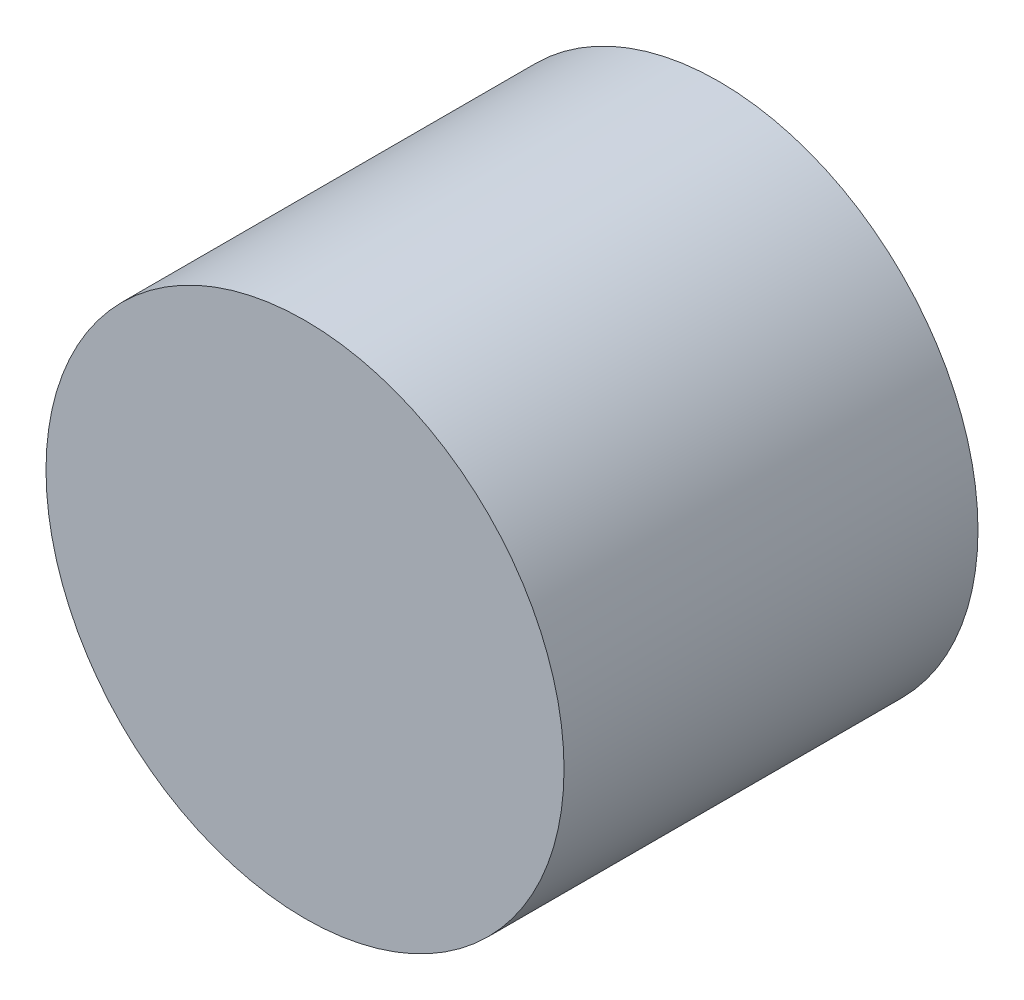
ISO-10303-21;
HEADER;
FILE_DESCRIPTION(('STEP AP214'),'2;1');
FILE_NAME('part.step','',(''),(''),'','','');
FILE_SCHEMA(('AUTOMOTIVE_DESIGN { 1 0 10303 214 1 1 1 1 }'));
ENDSEC;
DATA;
#1=APPLICATION_CONTEXT('core data for automotive mechanical design processes');
#2=APPLICATION_PROTOCOL_DEFINITION('international standard','automotive_design',2000,#1);
#3=PRODUCT_CONTEXT('',#1,'mechanical');
#4=PRODUCT('Part','Part','',(#3));
#5=PRODUCT_RELATED_PRODUCT_CATEGORY('part','',(#4));
#6=PRODUCT_DEFINITION_FORMATION('','',#4);
#7=PRODUCT_DEFINITION_CONTEXT('part definition',#1,'design');
#8=PRODUCT_DEFINITION('design','',#6,#7);
#9=PRODUCT_DEFINITION_SHAPE('','',#8);
#10=(LENGTH_UNIT() NAMED_UNIT(*) SI_UNIT(.MILLI.,.METRE.));
#11=(NAMED_UNIT(*) PLANE_ANGLE_UNIT() SI_UNIT($,.RADIAN.));
#12=(NAMED_UNIT(*) SI_UNIT($,.STERADIAN.) SOLID_ANGLE_UNIT());
#13=UNCERTAINTY_MEASURE_WITH_UNIT(LENGTH_MEASURE(1.E-05),#10,'distance_accuracy_value','');
#14=(GEOMETRIC_REPRESENTATION_CONTEXT(3) GLOBAL_UNCERTAINTY_ASSIGNED_CONTEXT((#13)) GLOBAL_UNIT_ASSIGNED_CONTEXT((#10,
#11,#12)) REPRESENTATION_CONTEXT('',''));
#15=CARTESIAN_POINT('',(0.,0.,0.));
#16=DIRECTION('',(0.,0.,1.));
#17=DIRECTION('',(1.,0.,0.));
#18=AXIS2_PLACEMENT_3D('',#15,#16,#17);
#19=CARTESIAN_POINT('',(0.,0.,100.));
#20=DIRECTION('',(0.,0.,-1.));
#21=DIRECTION('',(-1.,0.,0.));
#22=AXIS2_PLACEMENT_3D('',#19,#20,#21);
#23=CYLINDRICAL_SURFACE('',#22,62.5695662279006);
#24=CARTESIAN_POINT('',(0.,0.,100.));
#25=DIRECTION('',(0.,0.,1.));
#26=DIRECTION('',(1.,0.,0.));
#27=AXIS2_PLACEMENT_3D('',#24,#25,#26);
#28=CIRCLE('',#27,62.5695662279006);
#29=CARTESIAN_POINT('',(62.5695662279006,0.,100.));
#30=VERTEX_POINT('',#29);
#31=EDGE_CURVE('E10',#30,#30,#28,.T.);
#32=ORIENTED_EDGE('',*,*,#31,.F.);
#33=EDGE_LOOP('',(#32));
#34=FACE_BOUND('',#33,.T.);
#35=CARTESIAN_POINT('',(0.,0.,0.));
#36=DIRECTION('',(0.,0.,1.));
#37=DIRECTION('',(1.,0.,0.));
#38=AXIS2_PLACEMENT_3D('',#35,#36,#37);
#39=CIRCLE('',#38,62.5695662279006);
#40=CARTESIAN_POINT('',(62.5695662279006,0.,0.));
#41=VERTEX_POINT('',#40);
#42=EDGE_CURVE('E37',#41,#41,#39,.T.);
#43=ORIENTED_EDGE('',*,*,#42,.T.);
#44=EDGE_LOOP('',(#43));
#45=FACE_BOUND('',#44,.T.);
#46=ADVANCED_FACE('F34',(#34,#45),#23,.T.);
#47=CARTESIAN_POINT('',(0.,0.,100.));
#48=DIRECTION('',(0.,0.,1.));
#49=DIRECTION('',(1.,0.,0.));
#50=AXIS2_PLACEMENT_3D('',#47,#48,#49);
#51=PLANE('',#50);
#52=ORIENTED_EDGE('',*,*,#31,.T.);
#53=EDGE_LOOP('',(#52));
#54=FACE_BOUND('',#53,.T.);
#55=ADVANCED_FACE('F49',(#54),#51,.T.);
#56=CARTESIAN_POINT('',(0.,0.,0.));
#57=DIRECTION('',(0.,0.,1.));
#58=DIRECTION('',(1.,0.,0.));
#59=AXIS2_PLACEMENT_3D('',#56,#57,#58);
#60=PLANE('',#59);
#61=ORIENTED_EDGE('',*,*,#42,.F.);
#62=EDGE_LOOP('',(#61));
#63=FACE_BOUND('',#62,.T.);
#64=ADVANCED_FACE('F47',(#63),#60,.F.);
#65=CLOSED_SHELL('',(#46,#55,#64));
#66=MANIFOLD_SOLID_BREP('B2',#65);
#67=ADVANCED_BREP_SHAPE_REPRESENTATION('',(#18,#66),#14);
#68=SHAPE_DEFINITION_REPRESENTATION(#9,#67);
ENDSEC;
END-ISO-10303-21;
